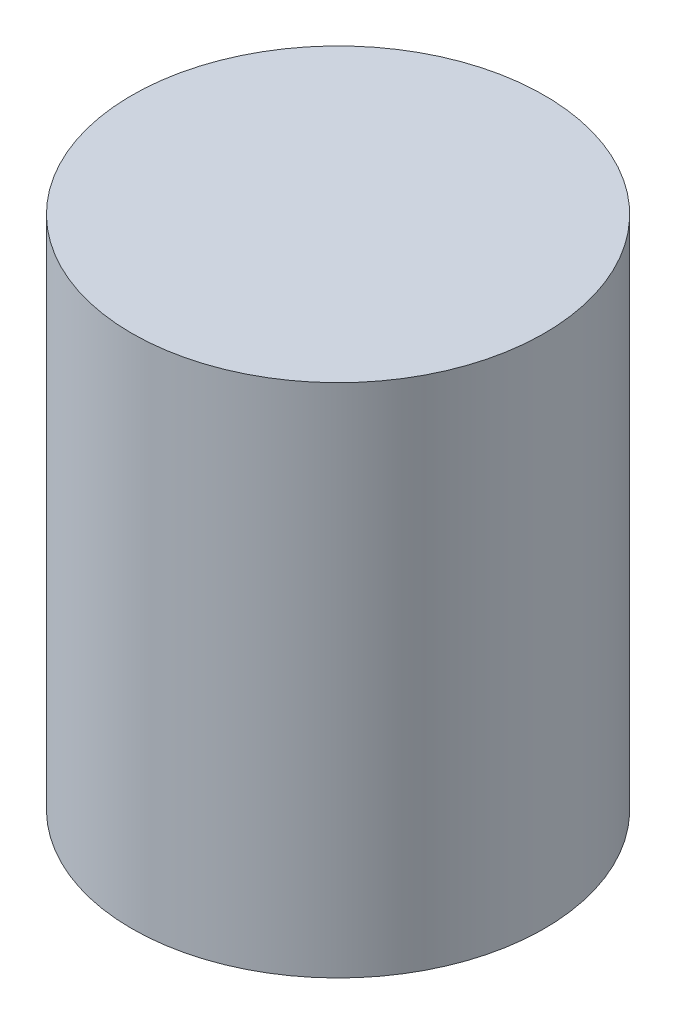
ISO-10303-21;
HEADER;
FILE_DESCRIPTION(('STEP AP214'),'2;1');
FILE_NAME('part.step','',(''),(''),'','','');
FILE_SCHEMA(('AUTOMOTIVE_DESIGN { 1 0 10303 214 1 1 1 1 }'));
ENDSEC;
DATA;
#1=APPLICATION_CONTEXT('core data for automotive mechanical design processes');
#2=APPLICATION_PROTOCOL_DEFINITION('international standard','automotive_design',2000,#1);
#3=PRODUCT_CONTEXT('',#1,'mechanical');
#4=PRODUCT('Part','Part','',(#3));
#5=PRODUCT_RELATED_PRODUCT_CATEGORY('part','',(#4));
#6=PRODUCT_DEFINITION_FORMATION('','',#4);
#7=PRODUCT_DEFINITION_CONTEXT('part definition',#1,'design');
#8=PRODUCT_DEFINITION('design','',#6,#7);
#9=PRODUCT_DEFINITION_SHAPE('','',#8);
#10=(LENGTH_UNIT() NAMED_UNIT(*) SI_UNIT(.MILLI.,.METRE.));
#11=(NAMED_UNIT(*) PLANE_ANGLE_UNIT() SI_UNIT($,.RADIAN.));
#12=(NAMED_UNIT(*) SI_UNIT($,.STERADIAN.) SOLID_ANGLE_UNIT());
#13=UNCERTAINTY_MEASURE_WITH_UNIT(LENGTH_MEASURE(1.E-05),#10,'distance_accuracy_value','');
#14=(GEOMETRIC_REPRESENTATION_CONTEXT(3) GLOBAL_UNCERTAINTY_ASSIGNED_CONTEXT((#13)) GLOBAL_UNIT_ASSIGNED_CONTEXT((#10,
#11,#12)) REPRESENTATION_CONTEXT('',''));
#15=CARTESIAN_POINT('',(0.,0.,0.));
#16=DIRECTION('',(0.,0.,1.));
#17=DIRECTION('',(1.,0.,0.));
#18=AXIS2_PLACEMENT_3D('',#15,#16,#17);
#19=CARTESIAN_POINT('',(0.,127.,0.));
#20=DIRECTION('',(0.,-1.,0.));
#21=DIRECTION('',(0.,0.,-1.));
#22=AXIS2_PLACEMENT_3D('',#19,#20,#21);
#23=CYLINDRICAL_SURFACE('',#22,50.8);
#24=CARTESIAN_POINT('',(0.,127.,0.));
#25=DIRECTION('',(0.,1.,0.));
#26=DIRECTION('',(0.,0.,1.));
#27=AXIS2_PLACEMENT_3D('',#24,#25,#26);
#28=CIRCLE('',#27,50.8);
#29=CARTESIAN_POINT('',(0.,127.,50.8));
#30=VERTEX_POINT('',#29);
#31=EDGE_CURVE('E10',#30,#30,#28,.T.);
#32=ORIENTED_EDGE('',*,*,#31,.F.);
#33=EDGE_LOOP('',(#32));
#34=FACE_BOUND('',#33,.T.);
#35=CARTESIAN_POINT('',(0.,0.,0.));
#36=DIRECTION('',(0.,1.,0.));
#37=DIRECTION('',(0.,0.,1.));
#38=AXIS2_PLACEMENT_3D('',#35,#36,#37);
#39=CIRCLE('',#38,50.8);
#40=CARTESIAN_POINT('',(0.,0.,50.8));
#41=VERTEX_POINT('',#40);
#42=EDGE_CURVE('E46',#41,#41,#39,.T.);
#43=ORIENTED_EDGE('',*,*,#42,.T.);
#44=EDGE_LOOP('',(#43));
#45=FACE_BOUND('',#44,.T.);
#46=ADVANCED_FACE('F43',(#34,#45),#23,.T.);
#47=CARTESIAN_POINT('',(0.,127.,0.));
#48=DIRECTION('',(0.,1.,0.));
#49=DIRECTION('',(0.,0.,1.));
#50=AXIS2_PLACEMENT_3D('',#47,#48,#49);
#51=PLANE('',#50);
#52=ORIENTED_EDGE('',*,*,#31,.T.);
#53=EDGE_LOOP('',(#52));
#54=FACE_BOUND('',#53,.T.);
#55=ADVANCED_FACE('F60',(#54),#51,.T.);
#56=CARTESIAN_POINT('',(0.,0.,0.));
#57=DIRECTION('',(0.,1.,0.));
#58=DIRECTION('',(0.,0.,1.));
#59=AXIS2_PLACEMENT_3D('',#56,#57,#58);
#60=PLANE('',#59);
#61=ORIENTED_EDGE('',*,*,#42,.F.);
#62=EDGE_LOOP('',(#61));
#63=FACE_BOUND('',#62,.T.);
#64=ADVANCED_FACE('F58',(#63),#60,.F.);
#65=CLOSED_SHELL('',(#46,#55,#64));
#66=MANIFOLD_SOLID_BREP('B2',#65);
#67=ADVANCED_BREP_SHAPE_REPRESENTATION('',(#18,#66),#14);
#68=SHAPE_DEFINITION_REPRESENTATION(#9,#67);
ENDSEC;
END-ISO-10303-21;
